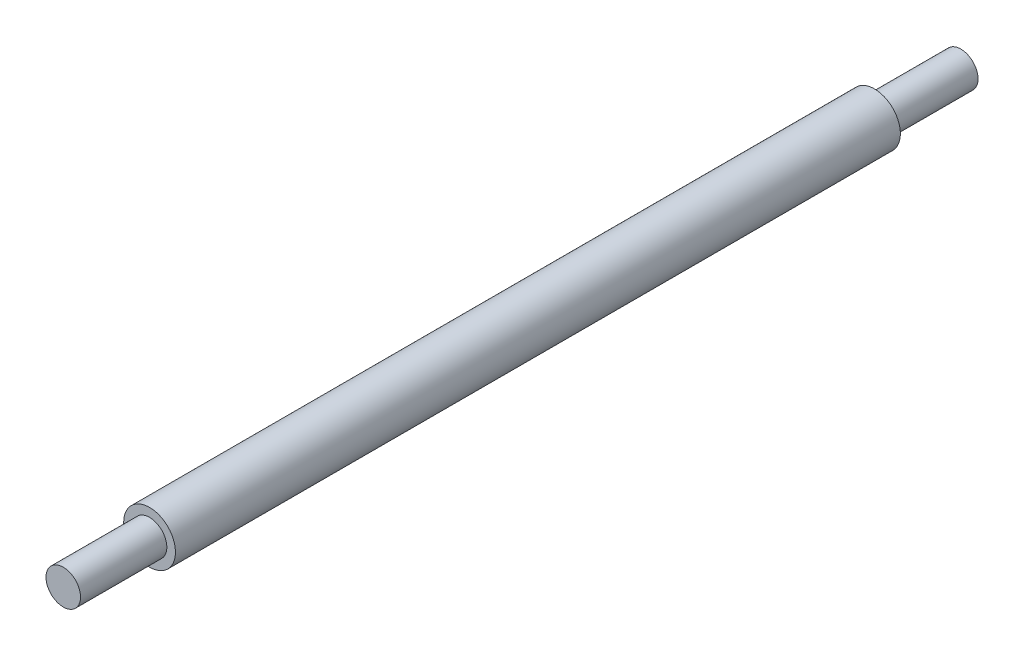
ISO-10303-21;
HEADER;
FILE_DESCRIPTION(('STEP AP214'),'2;1');
FILE_NAME('part.step','',(''),(''),'','','');
FILE_SCHEMA(('AUTOMOTIVE_DESIGN { 1 0 10303 214 1 1 1 1 }'));
ENDSEC;
DATA;
#1=APPLICATION_CONTEXT('core data for automotive mechanical design processes');
#2=APPLICATION_PROTOCOL_DEFINITION('international standard','automotive_design',2000,#1);
#3=PRODUCT_CONTEXT('',#1,'mechanical');
#4=PRODUCT('Part','Part','',(#3));
#5=PRODUCT_RELATED_PRODUCT_CATEGORY('part','',(#4));
#6=PRODUCT_DEFINITION_FORMATION('','',#4);
#7=PRODUCT_DEFINITION_CONTEXT('part definition',#1,'design');
#8=PRODUCT_DEFINITION('design','',#6,#7);
#9=PRODUCT_DEFINITION_SHAPE('','',#8);
#10=(LENGTH_UNIT() NAMED_UNIT(*) SI_UNIT(.MILLI.,.METRE.));
#11=(NAMED_UNIT(*) PLANE_ANGLE_UNIT() SI_UNIT($,.RADIAN.));
#12=(NAMED_UNIT(*) SI_UNIT($,.STERADIAN.) SOLID_ANGLE_UNIT());
#13=UNCERTAINTY_MEASURE_WITH_UNIT(LENGTH_MEASURE(1.E-05),#10,'distance_accuracy_value','');
#14=(GEOMETRIC_REPRESENTATION_CONTEXT(3) GLOBAL_UNCERTAINTY_ASSIGNED_CONTEXT((#13)) GLOBAL_UNIT_ASSIGNED_CONTEXT((#10,
#11,#12)) REPRESENTATION_CONTEXT('',''));
#15=CARTESIAN_POINT('',(0.,0.,0.));
#16=DIRECTION('',(0.,0.,1.));
#17=DIRECTION('',(1.,0.,0.));
#18=AXIS2_PLACEMENT_3D('',#15,#16,#17);
#19=CARTESIAN_POINT('',(0.,0.,0.));
#20=DIRECTION('',(0.,0.,1.));
#21=DIRECTION('',(1.,0.,0.));
#22=AXIS2_PLACEMENT_3D('',#19,#20,#21);
#23=PLANE('',#22);
#24=CARTESIAN_POINT('',(0.,0.,0.));
#25=DIRECTION('',(0.,0.,-1.));
#26=DIRECTION('',(-1.,0.,0.));
#27=AXIS2_PLACEMENT_3D('',#24,#25,#26);
#28=CIRCLE('',#27,2.);
#29=CARTESIAN_POINT('',(-2.,0.,0.));
#30=VERTEX_POINT('',#29);
#31=EDGE_CURVE('E10',#30,#30,#28,.T.);
#32=ORIENTED_EDGE('',*,*,#31,.F.);
#33=EDGE_LOOP('',(#32));
#34=FACE_BOUND('',#33,.T.);
#35=ADVANCED_FACE('F34',(#34),#23,.T.);
#36=CARTESIAN_POINT('',(0.,0.,-104.));
#37=DIRECTION('',(0.,0.,-1.));
#38=DIRECTION('',(-1.,0.,0.));
#39=AXIS2_PLACEMENT_3D('',#36,#37,#38);
#40=CYLINDRICAL_SURFACE('',#39,2.);
#41=ORIENTED_EDGE('',*,*,#31,.T.);
#42=EDGE_LOOP('',(#41));
#43=FACE_BOUND('',#42,.T.);
#44=CARTESIAN_POINT('',(0.,0.,-9.99999999999999));
#45=DIRECTION('',(0.,0.,-1.));
#46=DIRECTION('',(-1.,0.,0.));
#47=AXIS2_PLACEMENT_3D('',#44,#45,#46);
#48=CIRCLE('',#47,2.);
#49=CARTESIAN_POINT('',(-2.,0.,-9.99999999999999));
#50=VERTEX_POINT('',#49);
#51=EDGE_CURVE('E40',#50,#50,#48,.T.);
#52=ORIENTED_EDGE('',*,*,#51,.F.);
#53=EDGE_LOOP('',(#52));
#54=FACE_BOUND('',#53,.T.);
#55=ADVANCED_FACE('F76',(#43,#54),#40,.T.);
#56=CARTESIAN_POINT('',(0.,2.,-10.));
#57=DIRECTION('',(0.,0.,1.));
#58=DIRECTION('',(1.,0.,0.));
#59=AXIS2_PLACEMENT_3D('',#56,#57,#58);
#60=PLANE('',#59);
#61=ORIENTED_EDGE('',*,*,#51,.T.);
#62=EDGE_LOOP('',(#61));
#63=FACE_BOUND('',#62,.T.);
#64=CARTESIAN_POINT('',(0.,0.,-9.99999999999999));
#65=DIRECTION('',(0.,0.,-1.));
#66=DIRECTION('',(-1.,0.,0.));
#67=AXIS2_PLACEMENT_3D('',#64,#65,#66);
#68=CIRCLE('',#67,3.);
#69=CARTESIAN_POINT('',(-3.,0.,-9.99999999999999));
#70=VERTEX_POINT('',#69);
#71=EDGE_CURVE('E44',#70,#70,#68,.T.);
#72=ORIENTED_EDGE('',*,*,#71,.F.);
#73=EDGE_LOOP('',(#72));
#74=FACE_BOUND('',#73,.T.);
#75=ADVANCED_FACE('F81',(#63,#74),#60,.T.);
#76=CARTESIAN_POINT('',(0.,0.,-104.));
#77=DIRECTION('',(0.,0.,-1.));
#78=DIRECTION('',(-1.,0.,0.));
#79=AXIS2_PLACEMENT_3D('',#76,#77,#78);
#80=CYLINDRICAL_SURFACE('',#79,3.);
#81=ORIENTED_EDGE('',*,*,#71,.T.);
#82=EDGE_LOOP('',(#81));
#83=FACE_BOUND('',#82,.T.);
#84=CARTESIAN_POINT('',(0.,0.,-94.));
#85=DIRECTION('',(0.,0.,-1.));
#86=DIRECTION('',(-1.,0.,0.));
#87=AXIS2_PLACEMENT_3D('',#84,#85,#86);
#88=CIRCLE('',#87,3.);
#89=CARTESIAN_POINT('',(-3.,0.,-94.));
#90=VERTEX_POINT('',#89);
#91=EDGE_CURVE('E48',#90,#90,#88,.T.);
#92=ORIENTED_EDGE('',*,*,#91,.F.);
#93=EDGE_LOOP('',(#92));
#94=FACE_BOUND('',#93,.T.);
#95=ADVANCED_FACE('F72',(#83,#94),#80,.T.);
#96=CARTESIAN_POINT('',(0.,3.,-94.));
#97=DIRECTION('',(0.,0.,-1.));
#98=DIRECTION('',(-1.,0.,0.));
#99=AXIS2_PLACEMENT_3D('',#96,#97,#98);
#100=PLANE('',#99);
#101=ORIENTED_EDGE('',*,*,#91,.T.);
#102=EDGE_LOOP('',(#101));
#103=FACE_BOUND('',#102,.T.);
#104=CARTESIAN_POINT('',(0.,0.,-94.));
#105=DIRECTION('',(0.,0.,-1.));
#106=DIRECTION('',(-1.,0.,0.));
#107=AXIS2_PLACEMENT_3D('',#104,#105,#106);
#108=CIRCLE('',#107,2.);
#109=CARTESIAN_POINT('',(-2.,0.,-94.));
#110=VERTEX_POINT('',#109);
#111=EDGE_CURVE('E53',#110,#110,#108,.T.);
#112=ORIENTED_EDGE('',*,*,#111,.F.);
#113=EDGE_LOOP('',(#112));
#114=FACE_BOUND('',#113,.T.);
#115=ADVANCED_FACE('F64',(#103,#114),#100,.T.);
#116=CARTESIAN_POINT('',(0.,0.,-104.));
#117=DIRECTION('',(0.,0.,-1.));
#118=DIRECTION('',(-1.,0.,0.));
#119=AXIS2_PLACEMENT_3D('',#116,#117,#118);
#120=CYLINDRICAL_SURFACE('',#119,2.);
#121=ORIENTED_EDGE('',*,*,#111,.T.);
#122=EDGE_LOOP('',(#121));
#123=FACE_BOUND('',#122,.T.);
#124=CARTESIAN_POINT('',(0.,0.,-104.));
#125=DIRECTION('',(0.,0.,-1.));
#126=DIRECTION('',(-1.,0.,0.));
#127=AXIS2_PLACEMENT_3D('',#124,#125,#126);
#128=CIRCLE('',#127,2.);
#129=CARTESIAN_POINT('',(-2.,0.,-104.));
#130=VERTEX_POINT('',#129);
#131=EDGE_CURVE('E56',#130,#130,#128,.T.);
#132=ORIENTED_EDGE('',*,*,#131,.F.);
#133=EDGE_LOOP('',(#132));
#134=FACE_BOUND('',#133,.T.);
#135=ADVANCED_FACE('F62',(#123,#134),#120,.T.);
#136=CARTESIAN_POINT('',(0.,2.,-104.));
#137=DIRECTION('',(0.,0.,-1.));
#138=DIRECTION('',(-1.,0.,0.));
#139=AXIS2_PLACEMENT_3D('',#136,#137,#138);
#140=PLANE('',#139);
#141=ORIENTED_EDGE('',*,*,#131,.T.);
#142=EDGE_LOOP('',(#141));
#143=FACE_BOUND('',#142,.T.);
#144=ADVANCED_FACE('F60',(#143),#140,.T.);
#145=CLOSED_SHELL('',(#35,#55,#75,#95,#115,#135,#144));
#146=MANIFOLD_SOLID_BREP('B2',#145);
#147=ADVANCED_BREP_SHAPE_REPRESENTATION('',(#18,#146),#14);
#148=SHAPE_DEFINITION_REPRESENTATION(#9,#147);
ENDSEC;
END-ISO-10303-21;
